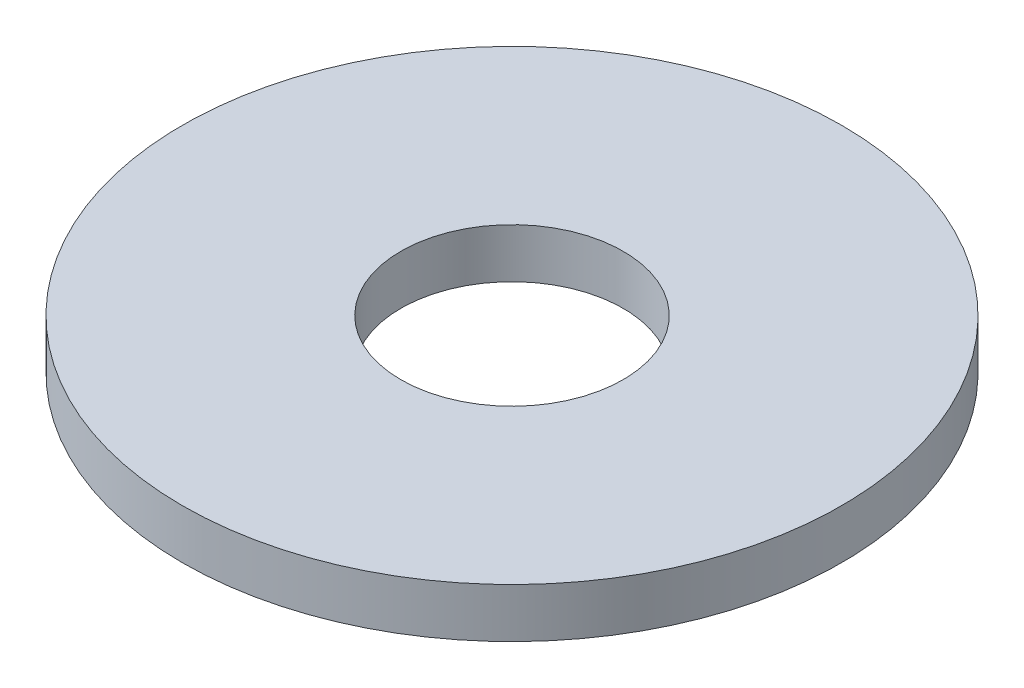
ISO-10303-21;
HEADER;
FILE_DESCRIPTION(('STEP AP214'),'2;1');
FILE_NAME('part.step','',(''),(''),'','','');
FILE_SCHEMA(('AUTOMOTIVE_DESIGN { 1 0 10303 214 1 1 1 1 }'));
ENDSEC;
DATA;
#1=APPLICATION_CONTEXT('core data for automotive mechanical design processes');
#2=APPLICATION_PROTOCOL_DEFINITION('international standard','automotive_design',2000,#1);
#3=PRODUCT_CONTEXT('',#1,'mechanical');
#4=PRODUCT('Part','Part','',(#3));
#5=PRODUCT_RELATED_PRODUCT_CATEGORY('part','',(#4));
#6=PRODUCT_DEFINITION_FORMATION('','',#4);
#7=PRODUCT_DEFINITION_CONTEXT('part definition',#1,'design');
#8=PRODUCT_DEFINITION('design','',#6,#7);
#9=PRODUCT_DEFINITION_SHAPE('','',#8);
#10=(LENGTH_UNIT() NAMED_UNIT(*) SI_UNIT(.MILLI.,.METRE.));
#11=(NAMED_UNIT(*) PLANE_ANGLE_UNIT() SI_UNIT($,.RADIAN.));
#12=(NAMED_UNIT(*) SI_UNIT($,.STERADIAN.) SOLID_ANGLE_UNIT());
#13=UNCERTAINTY_MEASURE_WITH_UNIT(LENGTH_MEASURE(1.E-05),#10,'distance_accuracy_value','');
#14=(GEOMETRIC_REPRESENTATION_CONTEXT(3) GLOBAL_UNCERTAINTY_ASSIGNED_CONTEXT((#13)) GLOBAL_UNIT_ASSIGNED_CONTEXT((#10,
#11,#12)) REPRESENTATION_CONTEXT('',''));
#15=CARTESIAN_POINT('',(0.,0.,0.));
#16=DIRECTION('',(0.,0.,1.));
#17=DIRECTION('',(1.,0.,0.));
#18=AXIS2_PLACEMENT_3D('',#15,#16,#17);
#19=CARTESIAN_POINT('',(0.,6.,0.));
#20=DIRECTION('',(0.,1.,0.));
#21=DIRECTION('',(0.,0.,1.));
#22=AXIS2_PLACEMENT_3D('',#19,#20,#21);
#23=PLANE('',#22);
#24=CARTESIAN_POINT('',(0.,6.,0.));
#25=DIRECTION('',(0.,1.,0.));
#26=DIRECTION('',(0.,0.,1.));
#27=AXIS2_PLACEMENT_3D('',#24,#25,#26);
#28=CIRCLE('',#27,40.);
#29=CARTESIAN_POINT('',(0.,6.,40.));
#30=VERTEX_POINT('',#29);
#31=EDGE_CURVE('E10',#30,#30,#28,.T.);
#32=ORIENTED_EDGE('',*,*,#31,.T.);
#33=EDGE_LOOP('',(#32));
#34=FACE_BOUND('',#33,.T.);
#35=CARTESIAN_POINT('',(0.,6.,0.));
#36=DIRECTION('',(0.,1.,0.));
#37=DIRECTION('',(0.,0.,1.));
#38=AXIS2_PLACEMENT_3D('',#35,#36,#37);
#39=CIRCLE('',#38,13.5);
#40=CARTESIAN_POINT('',(0.,6.,13.5));
#41=VERTEX_POINT('',#40);
#42=EDGE_CURVE('E44',#41,#41,#39,.T.);
#43=ORIENTED_EDGE('',*,*,#42,.F.);
#44=EDGE_LOOP('',(#43));
#45=FACE_BOUND('',#44,.T.);
#46=ADVANCED_FACE('F33',(#34,#45),#23,.T.);
#47=CARTESIAN_POINT('',(0.,0.,0.));
#48=DIRECTION('',(0.,1.,0.));
#49=DIRECTION('',(0.,0.,1.));
#50=AXIS2_PLACEMENT_3D('',#47,#48,#49);
#51=PLANE('',#50);
#52=CARTESIAN_POINT('',(0.,0.,0.));
#53=DIRECTION('',(0.,1.,0.));
#54=DIRECTION('',(0.,0.,1.));
#55=AXIS2_PLACEMENT_3D('',#52,#53,#54);
#56=CIRCLE('',#55,40.);
#57=CARTESIAN_POINT('',(0.,0.,40.));
#58=VERTEX_POINT('',#57);
#59=EDGE_CURVE('E37',#58,#58,#56,.T.);
#60=ORIENTED_EDGE('',*,*,#59,.F.);
#61=EDGE_LOOP('',(#60));
#62=FACE_BOUND('',#61,.T.);
#63=CARTESIAN_POINT('',(0.,0.,0.));
#64=DIRECTION('',(0.,1.,0.));
#65=DIRECTION('',(0.,0.,1.));
#66=AXIS2_PLACEMENT_3D('',#63,#64,#65);
#67=CIRCLE('',#66,13.5);
#68=CARTESIAN_POINT('',(0.,0.,13.5));
#69=VERTEX_POINT('',#68);
#70=EDGE_CURVE('E46',#69,#69,#67,.T.);
#71=ORIENTED_EDGE('',*,*,#70,.T.);
#72=EDGE_LOOP('',(#71));
#73=FACE_BOUND('',#72,.T.);
#74=ADVANCED_FACE('F56',(#62,#73),#51,.F.);
#75=CARTESIAN_POINT('',(0.,6.,0.));
#76=DIRECTION('',(0.,-1.,0.));
#77=DIRECTION('',(0.,0.,-1.));
#78=AXIS2_PLACEMENT_3D('',#75,#76,#77);
#79=CYLINDRICAL_SURFACE('',#78,40.);
#80=ORIENTED_EDGE('',*,*,#31,.F.);
#81=EDGE_LOOP('',(#80));
#82=FACE_BOUND('',#81,.T.);
#83=ORIENTED_EDGE('',*,*,#59,.T.);
#84=EDGE_LOOP('',(#83));
#85=FACE_BOUND('',#84,.T.);
#86=ADVANCED_FACE('F35',(#82,#85),#79,.T.);
#87=CARTESIAN_POINT('',(0.,6.,0.));
#88=DIRECTION('',(0.,-1.,0.));
#89=DIRECTION('',(0.,0.,-1.));
#90=AXIS2_PLACEMENT_3D('',#87,#88,#89);
#91=CYLINDRICAL_SURFACE('',#90,13.5);
#92=ORIENTED_EDGE('',*,*,#42,.T.);
#93=EDGE_LOOP('',(#92));
#94=FACE_BOUND('',#93,.T.);
#95=ORIENTED_EDGE('',*,*,#70,.F.);
#96=EDGE_LOOP('',(#95));
#97=FACE_BOUND('',#96,.T.);
#98=ADVANCED_FACE('F52',(#94,#97),#91,.F.);
#99=CLOSED_SHELL('',(#46,#74,#86,#98));
#100=MANIFOLD_SOLID_BREP('B2',#99);
#101=ADVANCED_BREP_SHAPE_REPRESENTATION('',(#18,#100),#14);
#102=SHAPE_DEFINITION_REPRESENTATION(#9,#101);
ENDSEC;
END-ISO-10303-21;
